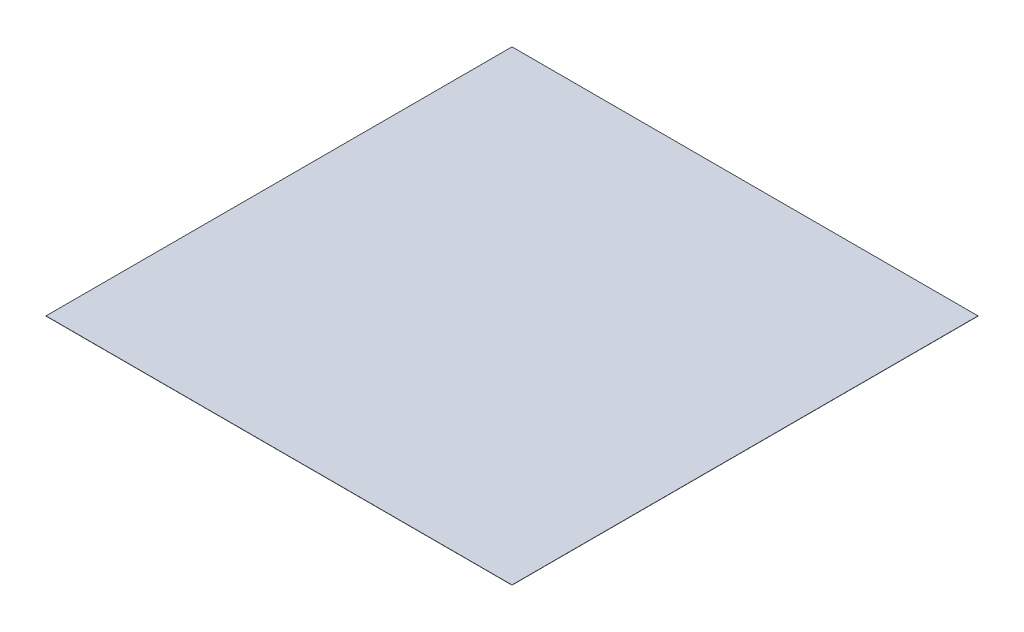
ISO-10303-21;
HEADER;
FILE_DESCRIPTION(('STEP AP214'),'2;1');
FILE_NAME('part.step','',(''),(''),'','','');
FILE_SCHEMA(('AUTOMOTIVE_DESIGN { 1 0 10303 214 1 1 1 1 }'));
ENDSEC;
DATA;
#1=APPLICATION_CONTEXT('core data for automotive mechanical design processes');
#2=APPLICATION_PROTOCOL_DEFINITION('international standard','automotive_design',2000,#1);
#3=PRODUCT_CONTEXT('',#1,'mechanical');
#4=PRODUCT('Part','Part','',(#3));
#5=PRODUCT_RELATED_PRODUCT_CATEGORY('part','',(#4));
#6=PRODUCT_DEFINITION_FORMATION('','',#4);
#7=PRODUCT_DEFINITION_CONTEXT('part definition',#1,'design');
#8=PRODUCT_DEFINITION('design','',#6,#7);
#9=PRODUCT_DEFINITION_SHAPE('','',#8);
#10=(LENGTH_UNIT() NAMED_UNIT(*) SI_UNIT(.MILLI.,.METRE.));
#11=(NAMED_UNIT(*) PLANE_ANGLE_UNIT() SI_UNIT($,.RADIAN.));
#12=(NAMED_UNIT(*) SI_UNIT($,.STERADIAN.) SOLID_ANGLE_UNIT());
#13=UNCERTAINTY_MEASURE_WITH_UNIT(LENGTH_MEASURE(1.E-05),#10,'distance_accuracy_value','');
#14=(GEOMETRIC_REPRESENTATION_CONTEXT(3) GLOBAL_UNCERTAINTY_ASSIGNED_CONTEXT((#13)) GLOBAL_UNIT_ASSIGNED_CONTEXT((#10,
#11,#12)) REPRESENTATION_CONTEXT('',''));
#15=CARTESIAN_POINT('',(0.,0.,0.));
#16=DIRECTION('',(0.,0.,1.));
#17=DIRECTION('',(1.,0.,0.));
#18=AXIS2_PLACEMENT_3D('',#15,#16,#17);
#19=CARTESIAN_POINT('',(1200.,1.,-1200.));
#20=DIRECTION('',(-1.,0.,0.));
#21=DIRECTION('',(0.,0.,1.));
#22=AXIS2_PLACEMENT_3D('',#19,#20,#21);
#23=PLANE('',#22);
#24=DIRECTION('',(0.,0.,-1.));
#25=VECTOR('',#24,1.);
#26=CARTESIAN_POINT('',(1200.,0.,-1200.));
#27=LINE('',#26,#25);
#28=CARTESIAN_POINT('',(1200.,0.,1200.));
#29=VERTEX_POINT('',#28);
#30=CARTESIAN_POINT('',(1200.,0.,-1200.));
#31=VERTEX_POINT('',#30);
#32=EDGE_CURVE('E99',#29,#31,#27,.T.);
#33=ORIENTED_EDGE('',*,*,#32,.T.);
#34=DIRECTION('',(0.,-1.,0.));
#35=VECTOR('',#34,1.);
#36=CARTESIAN_POINT('',(1200.,1.,-1200.));
#37=LINE('',#36,#35);
#38=CARTESIAN_POINT('',(1200.,1.,-1200.));
#39=VERTEX_POINT('',#38);
#40=EDGE_CURVE('E11',#39,#31,#37,.T.);
#41=ORIENTED_EDGE('',*,*,#40,.F.);
#42=DIRECTION('',(0.,0.,-1.));
#43=VECTOR('',#42,1.);
#44=CARTESIAN_POINT('',(1200.,1.,-1200.));
#45=LINE('',#44,#43);
#46=CARTESIAN_POINT('',(1200.,1.,1200.));
#47=VERTEX_POINT('',#46);
#48=EDGE_CURVE('E87',#47,#39,#45,.T.);
#49=ORIENTED_EDGE('',*,*,#48,.F.);
#50=DIRECTION('',(0.,-1.,0.));
#51=VECTOR('',#50,1.);
#52=CARTESIAN_POINT('',(1200.,1.,1200.));
#53=LINE('',#52,#51);
#54=EDGE_CURVE('E95',#47,#29,#53,.T.);
#55=ORIENTED_EDGE('',*,*,#54,.T.);
#56=EDGE_LOOP('',(#33,#41,#49,#55));
#57=FACE_BOUND('',#56,.T.);
#58=ADVANCED_FACE('F36',(#57),#23,.F.);
#59=CARTESIAN_POINT('',(-1200.,1.,-1200.));
#60=DIRECTION('',(0.,0.,1.));
#61=DIRECTION('',(1.,0.,0.));
#62=AXIS2_PLACEMENT_3D('',#59,#60,#61);
#63=PLANE('',#62);
#64=DIRECTION('',(-1.,0.,0.));
#65=VECTOR('',#64,1.);
#66=CARTESIAN_POINT('',(-1200.,0.,-1200.));
#67=LINE('',#66,#65);
#68=CARTESIAN_POINT('',(-1200.,0.,-1200.));
#69=VERTEX_POINT('',#68);
#70=EDGE_CURVE('E91',#31,#69,#67,.T.);
#71=ORIENTED_EDGE('',*,*,#70,.T.);
#72=DIRECTION('',(0.,-1.,0.));
#73=VECTOR('',#72,1.);
#74=CARTESIAN_POINT('',(-1200.,1.,-1200.));
#75=LINE('',#74,#73);
#76=CARTESIAN_POINT('',(-1200.,1.,-1200.));
#77=VERTEX_POINT('',#76);
#78=EDGE_CURVE('E44',#77,#69,#75,.T.);
#79=ORIENTED_EDGE('',*,*,#78,.F.);
#80=DIRECTION('',(-1.,0.,0.));
#81=VECTOR('',#80,1.);
#82=CARTESIAN_POINT('',(-1200.,1.,-1200.));
#83=LINE('',#82,#81);
#84=EDGE_CURVE('E82',#39,#77,#83,.T.);
#85=ORIENTED_EDGE('',*,*,#84,.F.);
#86=ORIENTED_EDGE('',*,*,#40,.T.);
#87=EDGE_LOOP('',(#71,#79,#85,#86));
#88=FACE_BOUND('',#87,.T.);
#89=ADVANCED_FACE('F90',(#88),#63,.F.);
#90=CARTESIAN_POINT('',(-1200.,1.,-1200.));
#91=DIRECTION('',(1.,0.,0.));
#92=DIRECTION('',(0.,0.,-1.));
#93=AXIS2_PLACEMENT_3D('',#90,#91,#92);
#94=PLANE('',#93);
#95=DIRECTION('',(0.,0.,1.));
#96=VECTOR('',#95,1.);
#97=CARTESIAN_POINT('',(-1200.,0.,-1200.));
#98=LINE('',#97,#96);
#99=CARTESIAN_POINT('',(-1200.,0.,1200.));
#100=VERTEX_POINT('',#99);
#101=EDGE_CURVE('E69',#69,#100,#98,.T.);
#102=ORIENTED_EDGE('',*,*,#101,.T.);
#103=DIRECTION('',(0.,-1.,0.));
#104=VECTOR('',#103,1.);
#105=CARTESIAN_POINT('',(-1200.,1.,1200.));
#106=LINE('',#105,#104);
#107=CARTESIAN_POINT('',(-1200.,1.,1200.));
#108=VERTEX_POINT('',#107);
#109=EDGE_CURVE('E92',#108,#100,#106,.T.);
#110=ORIENTED_EDGE('',*,*,#109,.F.);
#111=DIRECTION('',(0.,0.,1.));
#112=VECTOR('',#111,1.);
#113=CARTESIAN_POINT('',(-1200.,1.,-1200.));
#114=LINE('',#113,#112);
#115=EDGE_CURVE('E85',#77,#108,#114,.T.);
#116=ORIENTED_EDGE('',*,*,#115,.F.);
#117=ORIENTED_EDGE('',*,*,#78,.T.);
#118=EDGE_LOOP('',(#102,#110,#116,#117));
#119=FACE_BOUND('',#118,.T.);
#120=ADVANCED_FACE('F93',(#119),#94,.F.);
#121=CARTESIAN_POINT('',(-1200.,1.,1200.));
#122=DIRECTION('',(0.,0.,-1.));
#123=DIRECTION('',(-1.,0.,0.));
#124=AXIS2_PLACEMENT_3D('',#121,#122,#123);
#125=PLANE('',#124);
#126=DIRECTION('',(1.,0.,0.));
#127=VECTOR('',#126,1.);
#128=CARTESIAN_POINT('',(-1200.,0.,1200.));
#129=LINE('',#128,#127);
#130=EDGE_CURVE('E75',#100,#29,#129,.T.);
#131=ORIENTED_EDGE('',*,*,#130,.T.);
#132=ORIENTED_EDGE('',*,*,#54,.F.);
#133=DIRECTION('',(1.,0.,0.));
#134=VECTOR('',#133,1.);
#135=CARTESIAN_POINT('',(-1200.,1.,1200.));
#136=LINE('',#135,#134);
#137=EDGE_CURVE('E52',#108,#47,#136,.T.);
#138=ORIENTED_EDGE('',*,*,#137,.F.);
#139=ORIENTED_EDGE('',*,*,#109,.T.);
#140=EDGE_LOOP('',(#131,#132,#138,#139));
#141=FACE_BOUND('',#140,.T.);
#142=ADVANCED_FACE('F106',(#141),#125,.F.);
#143=CARTESIAN_POINT('',(0.,1.,0.));
#144=DIRECTION('',(0.,1.,0.));
#145=DIRECTION('',(0.,0.,1.));
#146=AXIS2_PLACEMENT_3D('',#143,#144,#145);
#147=PLANE('',#146);
#148=ORIENTED_EDGE('',*,*,#48,.T.);
#149=ORIENTED_EDGE('',*,*,#84,.T.);
#150=ORIENTED_EDGE('',*,*,#115,.T.);
#151=ORIENTED_EDGE('',*,*,#137,.T.);
#152=EDGE_LOOP('',(#148,#149,#150,#151));
#153=FACE_BOUND('',#152,.T.);
#154=ADVANCED_FACE('F83',(#153),#147,.T.);
#155=CARTESIAN_POINT('',(0.,0.,0.));
#156=DIRECTION('',(0.,1.,0.));
#157=DIRECTION('',(0.,0.,1.));
#158=AXIS2_PLACEMENT_3D('',#155,#156,#157);
#159=PLANE('',#158);
#160=ORIENTED_EDGE('',*,*,#32,.F.);
#161=ORIENTED_EDGE('',*,*,#130,.F.);
#162=ORIENTED_EDGE('',*,*,#101,.F.);
#163=ORIENTED_EDGE('',*,*,#70,.F.);
#164=EDGE_LOOP('',(#160,#161,#162,#163));
#165=FACE_BOUND('',#164,.T.);
#166=ADVANCED_FACE('F109',(#165),#159,.F.);
#167=CLOSED_SHELL('',(#58,#89,#120,#142,#154,#166));
#168=MANIFOLD_SOLID_BREP('B2',#167);
#169=ADVANCED_BREP_SHAPE_REPRESENTATION('',(#18,#168),#14);
#170=SHAPE_DEFINITION_REPRESENTATION(#9,#169);
ENDSEC;
END-ISO-10303-21;
